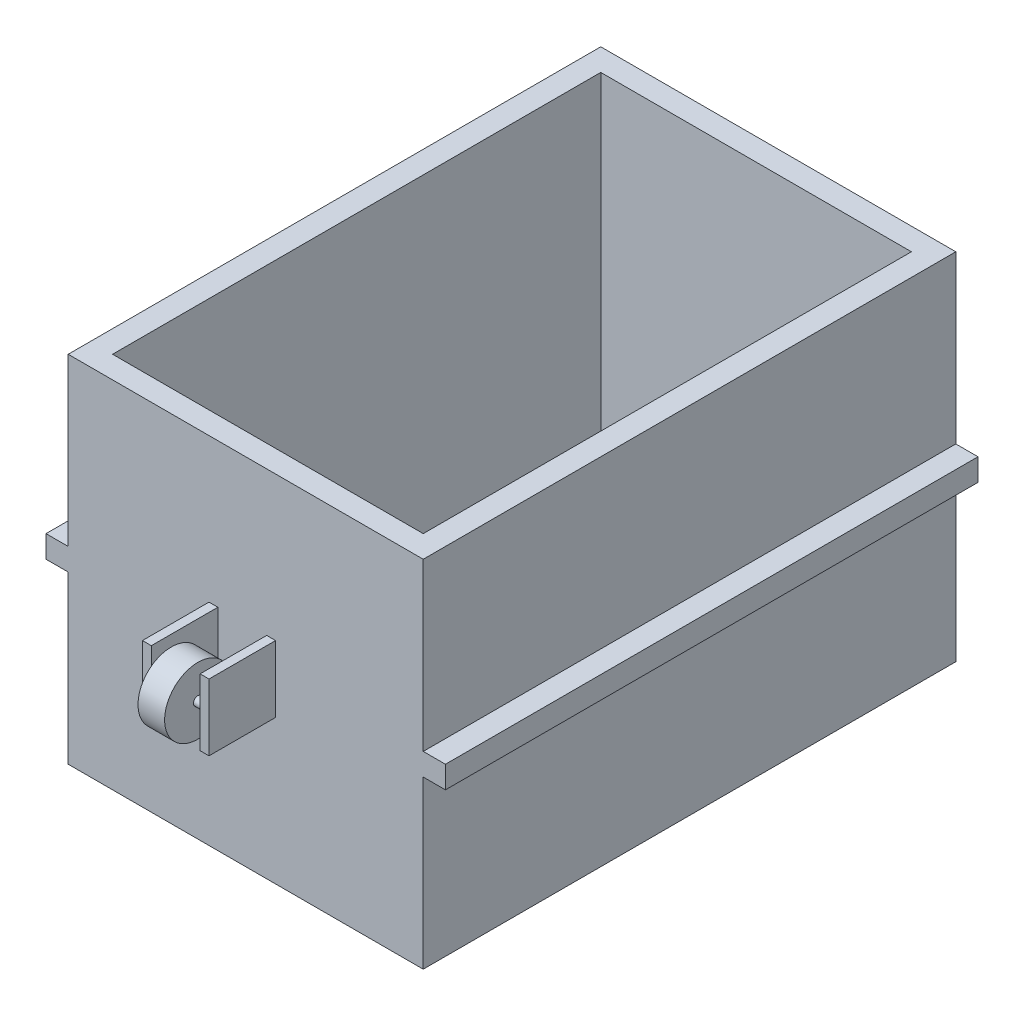
ISO-10303-21;
HEADER;
FILE_DESCRIPTION(('STEP AP214'),'2;1');
FILE_NAME('part.step','',(''),(''),'','','');
FILE_SCHEMA(('AUTOMOTIVE_DESIGN { 1 0 10303 214 1 1 1 1 }'));
ENDSEC;
DATA;
#1=APPLICATION_CONTEXT('core data for automotive mechanical design processes');
#2=APPLICATION_PROTOCOL_DEFINITION('international standard','automotive_design',2000,#1);
#3=PRODUCT_CONTEXT('',#1,'mechanical');
#4=PRODUCT('Part','Part','',(#3));
#5=PRODUCT_RELATED_PRODUCT_CATEGORY('part','',(#4));
#6=PRODUCT_DEFINITION_FORMATION('','',#4);
#7=PRODUCT_DEFINITION_CONTEXT('part definition',#1,'design');
#8=PRODUCT_DEFINITION('design','',#6,#7);
#9=PRODUCT_DEFINITION_SHAPE('','',#8);
#10=(LENGTH_UNIT() NAMED_UNIT(*) SI_UNIT(.MILLI.,.METRE.));
#11=(NAMED_UNIT(*) PLANE_ANGLE_UNIT() SI_UNIT($,.RADIAN.));
#12=(NAMED_UNIT(*) SI_UNIT($,.STERADIAN.) SOLID_ANGLE_UNIT());
#13=UNCERTAINTY_MEASURE_WITH_UNIT(LENGTH_MEASURE(1.E-05),#10,'distance_accuracy_value','');
#14=(GEOMETRIC_REPRESENTATION_CONTEXT(3) GLOBAL_UNCERTAINTY_ASSIGNED_CONTEXT((#13)) GLOBAL_UNIT_ASSIGNED_CONTEXT((#10,
#11,#12)) REPRESENTATION_CONTEXT('',''));
#15=CARTESIAN_POINT('',(0.,0.,0.));
#16=DIRECTION('',(0.,0.,1.));
#17=DIRECTION('',(1.,0.,0.));
#18=AXIS2_PLACEMENT_3D('',#15,#16,#17);
#19=CARTESIAN_POINT('',(167.145511261021,-200.,665.));
#20=DIRECTION('',(1.,0.,0.));
#21=DIRECTION('',(0.,0.,-1.));
#22=AXIS2_PLACEMENT_3D('',#19,#20,#21);
#23=CYLINDRICAL_SURFACE('',#22,5.00000000000005);
#24=CARTESIAN_POINT('',(168.645511261021,-200.,665.));
#25=DIRECTION('',(1.,0.,0.));
#26=DIRECTION('',(0.,0.,-1.));
#27=AXIS2_PLACEMENT_3D('',#24,#25,#26);
#28=CIRCLE('',#27,5.00000000000005);
#29=CARTESIAN_POINT('',(168.645511261021,-200.,660.));
#30=VERTEX_POINT('',#29);
#31=EDGE_CURVE('E41',#30,#30,#28,.T.);
#32=ORIENTED_EDGE('',*,*,#31,.T.);
#33=EDGE_LOOP('',(#32));
#34=FACE_BOUND('',#33,.T.);
#35=CARTESIAN_POINT('',(181.145511261021,-200.,665.));
#36=DIRECTION('',(1.,0.,0.));
#37=DIRECTION('',(0.,0.,-1.));
#38=AXIS2_PLACEMENT_3D('',#35,#36,#37);
#39=CIRCLE('',#38,5.00000000000005);
#40=CARTESIAN_POINT('',(181.145511261021,-200.,660.));
#41=VERTEX_POINT('',#40);
#42=EDGE_CURVE('E36',#41,#41,#39,.F.);
#43=ORIENTED_EDGE('',*,*,#42,.T.);
#44=EDGE_LOOP('',(#43));
#45=FACE_BOUND('',#44,.T.);
#46=ADVANCED_FACE('F32',(#34,#45),#23,.T.);
#47=CARTESIAN_POINT('',(233.645511261021,-162.5,675.));
#48=DIRECTION('',(0.,-1.,0.));
#49=DIRECTION('',(0.,0.,-1.));
#50=AXIS2_PLACEMENT_3D('',#47,#48,#49);
#51=PLANE('',#50);
#52=DIRECTION('',(0.,0.,-1.));
#53=VECTOR('',#52,1.);
#54=CARTESIAN_POINT('',(168.645511261021,-162.5,675.));
#55=LINE('',#54,#53);
#56=CARTESIAN_POINT('',(168.645511261021,-162.5,675.));
#57=VERTEX_POINT('',#56);
#58=CARTESIAN_POINT('',(168.645511261021,-162.5,600.));
#59=VERTEX_POINT('',#58);
#60=EDGE_CURVE('E48',#57,#59,#55,.T.);
#61=ORIENTED_EDGE('',*,*,#60,.T.);
#62=DIRECTION('',(-1.,0.,0.));
#63=VECTOR('',#62,1.);
#64=CARTESIAN_POINT('',(233.645511261021,-162.5,600.));
#65=LINE('',#64,#63);
#66=CARTESIAN_POINT('',(158.645511261021,-162.5,600.));
#67=VERTEX_POINT('',#66);
#68=EDGE_CURVE('E210',#59,#67,#65,.T.);
#69=ORIENTED_EDGE('',*,*,#68,.T.);
#70=DIRECTION('',(0.,0.,-1.));
#71=VECTOR('',#70,1.);
#72=CARTESIAN_POINT('',(158.645511261021,-162.5,675.));
#73=LINE('',#72,#71);
#74=CARTESIAN_POINT('',(158.645511261021,-162.5,675.));
#75=VERTEX_POINT('',#74);
#76=EDGE_CURVE('E228',#75,#67,#73,.T.);
#77=ORIENTED_EDGE('',*,*,#76,.F.);
#78=DIRECTION('',(-1.,0.,0.));
#79=VECTOR('',#78,1.);
#80=CARTESIAN_POINT('',(233.645511261021,-162.5,675.));
#81=LINE('',#80,#79);
#82=EDGE_CURVE('E217',#57,#75,#81,.T.);
#83=ORIENTED_EDGE('',*,*,#82,.F.);
#84=EDGE_LOOP('',(#61,#69,#77,#83));
#85=FACE_BOUND('',#84,.T.);
#86=ADVANCED_FACE('F372',(#85),#51,.F.);
#87=CARTESIAN_POINT('',(233.645511261021,-237.5,675.));
#88=DIRECTION('',(0.,1.,0.));
#89=DIRECTION('',(-1.,0.,0.));
#90=AXIS2_PLACEMENT_3D('',#87,#88,#89);
#91=PLANE('',#90);
#92=DIRECTION('',(0.,0.,-1.));
#93=VECTOR('',#92,1.);
#94=CARTESIAN_POINT('',(168.645511261021,-237.5,675.));
#95=LINE('',#94,#93);
#96=CARTESIAN_POINT('',(168.645511261021,-237.5,675.));
#97=VERTEX_POINT('',#96);
#98=CARTESIAN_POINT('',(168.645511261021,-237.5,600.));
#99=VERTEX_POINT('',#98);
#100=EDGE_CURVE('E194',#97,#99,#95,.T.);
#101=ORIENTED_EDGE('',*,*,#100,.F.);
#102=DIRECTION('',(1.,0.,0.));
#103=VECTOR('',#102,1.);
#104=CARTESIAN_POINT('',(233.645511261021,-237.5,675.));
#105=LINE('',#104,#103);
#106=CARTESIAN_POINT('',(158.645511261021,-237.5,675.));
#107=VERTEX_POINT('',#106);
#108=EDGE_CURVE('E226',#107,#97,#105,.T.);
#109=ORIENTED_EDGE('',*,*,#108,.F.);
#110=DIRECTION('',(0.,0.,-1.));
#111=VECTOR('',#110,1.);
#112=CARTESIAN_POINT('',(158.645511261021,-237.5,675.));
#113=LINE('',#112,#111);
#114=CARTESIAN_POINT('',(158.645511261021,-237.5,600.));
#115=VERTEX_POINT('',#114);
#116=EDGE_CURVE('E56',#107,#115,#113,.T.);
#117=ORIENTED_EDGE('',*,*,#116,.T.);
#118=DIRECTION('',(1.,0.,0.));
#119=VECTOR('',#118,1.);
#120=CARTESIAN_POINT('',(233.645511261021,-237.5,600.));
#121=LINE('',#120,#119);
#122=EDGE_CURVE('E209',#115,#99,#121,.T.);
#123=ORIENTED_EDGE('',*,*,#122,.T.);
#124=EDGE_LOOP('',(#101,#109,#117,#123));
#125=FACE_BOUND('',#124,.T.);
#126=ADVANCED_FACE('F212',(#125),#91,.F.);
#127=CARTESIAN_POINT('',(0.,0.,675.));
#128=DIRECTION('',(0.,0.,1.));
#129=DIRECTION('',(1.,0.,0.));
#130=AXIS2_PLACEMENT_3D('',#127,#128,#129);
#131=PLANE('',#130);
#132=ORIENTED_EDGE('',*,*,#108,.T.);
#133=DIRECTION('',(0.,1.,0.));
#134=VECTOR('',#133,1.);
#135=CARTESIAN_POINT('',(168.645511261021,-237.5,675.));
#136=LINE('',#135,#134);
#137=EDGE_CURVE('E198',#97,#57,#136,.T.);
#138=ORIENTED_EDGE('',*,*,#137,.T.);
#139=ORIENTED_EDGE('',*,*,#82,.T.);
#140=DIRECTION('',(0.,-1.,0.));
#141=VECTOR('',#140,1.);
#142=CARTESIAN_POINT('',(158.645511261021,-237.5,675.));
#143=LINE('',#142,#141);
#144=EDGE_CURVE('E420',#75,#107,#143,.T.);
#145=ORIENTED_EDGE('',*,*,#144,.T.);
#146=EDGE_LOOP('',(#132,#138,#139,#145));
#147=FACE_BOUND('',#146,.T.);
#148=ADVANCED_FACE('F436',(#147),#131,.T.);
#149=CARTESIAN_POINT('',(0.,0.,600.));
#150=DIRECTION('',(0.,0.,1.));
#151=DIRECTION('',(1.,0.,0.));
#152=AXIS2_PLACEMENT_3D('',#149,#150,#151);
#153=PLANE('',#152);
#154=ORIENTED_EDGE('',*,*,#68,.F.);
#155=DIRECTION('',(0.,1.,0.));
#156=VECTOR('',#155,1.);
#157=CARTESIAN_POINT('',(168.645511261021,-237.5,600.));
#158=LINE('',#157,#156);
#159=EDGE_CURVE('E197',#99,#59,#158,.T.);
#160=ORIENTED_EDGE('',*,*,#159,.F.);
#161=ORIENTED_EDGE('',*,*,#122,.F.);
#162=DIRECTION('',(0.,-1.,0.));
#163=VECTOR('',#162,1.);
#164=CARTESIAN_POINT('',(158.645511261021,-237.5,600.));
#165=LINE('',#164,#163);
#166=EDGE_CURVE('E219',#67,#115,#165,.T.);
#167=ORIENTED_EDGE('',*,*,#166,.F.);
#168=EDGE_LOOP('',(#154,#160,#161,#167));
#169=FACE_BOUND('',#168,.T.);
#170=DIRECTION('',(0.,-1.,0.));
#171=VECTOR('',#170,1.);
#172=CARTESIAN_POINT('',(0.,0.,600.));
#173=LINE('',#172,#171);
#174=CARTESIAN_POINT('',(0.,0.,600.));
#175=VERTEX_POINT('',#174);
#176=CARTESIAN_POINT('',(0.,-187.5,600.));
#177=VERTEX_POINT('',#176);
#178=EDGE_CURVE('E316',#175,#177,#173,.T.);
#179=ORIENTED_EDGE('',*,*,#178,.T.);
#180=DIRECTION('',(-1.,0.,0.));
#181=VECTOR('',#180,1.);
#182=CARTESIAN_POINT('',(0.,-187.5,600.));
#183=LINE('',#182,#181);
#184=CARTESIAN_POINT('',(-25.,-187.5,600.));
#185=VERTEX_POINT('',#184);
#186=EDGE_CURVE('E233',#177,#185,#183,.T.);
#187=ORIENTED_EDGE('',*,*,#186,.T.);
#188=DIRECTION('',(0.,-1.,0.));
#189=VECTOR('',#188,1.);
#190=CARTESIAN_POINT('',(-25.,-212.5,600.));
#191=LINE('',#190,#189);
#192=CARTESIAN_POINT('',(-25.,-212.5,600.));
#193=VERTEX_POINT('',#192);
#194=EDGE_CURVE('E246',#185,#193,#191,.T.);
#195=ORIENTED_EDGE('',*,*,#194,.T.);
#196=DIRECTION('',(1.,0.,0.));
#197=VECTOR('',#196,1.);
#198=CARTESIAN_POINT('',(0.,-212.5,600.));
#199=LINE('',#198,#197);
#200=CARTESIAN_POINT('',(0.,-212.5,600.));
#201=VERTEX_POINT('',#200);
#202=EDGE_CURVE('E238',#193,#201,#199,.T.);
#203=ORIENTED_EDGE('',*,*,#202,.T.);
#204=CARTESIAN_POINT('',(0.,-400.,600.));
#205=VERTEX_POINT('',#204);
#206=EDGE_CURVE('E320',#201,#205,#173,.T.);
#207=ORIENTED_EDGE('',*,*,#206,.T.);
#208=DIRECTION('',(1.,0.,0.));
#209=VECTOR('',#208,1.);
#210=CARTESIAN_POINT('',(0.,-400.,600.));
#211=LINE('',#210,#209);
#212=CARTESIAN_POINT('',(400.,-400.,600.));
#213=VERTEX_POINT('',#212);
#214=EDGE_CURVE('E319',#205,#213,#211,.T.);
#215=ORIENTED_EDGE('',*,*,#214,.T.);
#216=DIRECTION('',(0.,1.,0.));
#217=VECTOR('',#216,1.);
#218=CARTESIAN_POINT('',(400.,0.,600.));
#219=LINE('',#218,#217);
#220=CARTESIAN_POINT('',(400.,-212.5,600.));
#221=VERTEX_POINT('',#220);
#222=EDGE_CURVE('E323',#213,#221,#219,.T.);
#223=ORIENTED_EDGE('',*,*,#222,.T.);
#224=DIRECTION('',(1.,0.,0.));
#225=VECTOR('',#224,1.);
#226=CARTESIAN_POINT('',(400.,-212.5,600.));
#227=LINE('',#226,#225);
#228=CARTESIAN_POINT('',(425.,-212.5,600.));
#229=VERTEX_POINT('',#228);
#230=EDGE_CURVE('E253',#221,#229,#227,.T.);
#231=ORIENTED_EDGE('',*,*,#230,.T.);
#232=DIRECTION('',(0.,1.,0.));
#233=VECTOR('',#232,1.);
#234=CARTESIAN_POINT('',(425.,-212.5,600.));
#235=LINE('',#234,#233);
#236=CARTESIAN_POINT('',(425.,-187.5,600.));
#237=VERTEX_POINT('',#236);
#238=EDGE_CURVE('E272',#229,#237,#235,.T.);
#239=ORIENTED_EDGE('',*,*,#238,.T.);
#240=DIRECTION('',(-1.,0.,0.));
#241=VECTOR('',#240,1.);
#242=CARTESIAN_POINT('',(400.,-187.5,600.));
#243=LINE('',#242,#241);
#244=CARTESIAN_POINT('',(400.,-187.5,600.));
#245=VERTEX_POINT('',#244);
#246=EDGE_CURVE('E264',#237,#245,#243,.T.);
#247=ORIENTED_EDGE('',*,*,#246,.T.);
#248=CARTESIAN_POINT('',(400.,0.,600.));
#249=VERTEX_POINT('',#248);
#250=EDGE_CURVE('E322',#245,#249,#219,.T.);
#251=ORIENTED_EDGE('',*,*,#250,.T.);
#252=DIRECTION('',(-1.,0.,0.));
#253=VECTOR('',#252,1.);
#254=CARTESIAN_POINT('',(0.,0.,600.));
#255=LINE('',#254,#253);
#256=EDGE_CURVE('E326',#249,#175,#255,.T.);
#257=ORIENTED_EDGE('',*,*,#256,.T.);
#258=EDGE_LOOP('',(#179,#187,#195,#203,#207,#215,#223,#231,#239,#247,#251,#257));
#259=FACE_BOUND('',#258,.T.);
#260=CARTESIAN_POINT('',(233.645511261021,-162.5,600.));
#261=VERTEX_POINT('',#260);
#262=CARTESIAN_POINT('',(223.645511261021,-162.5,600.));
#263=VERTEX_POINT('',#262);
#264=EDGE_CURVE('E425',#261,#263,#65,.T.);
#265=ORIENTED_EDGE('',*,*,#264,.F.);
#266=DIRECTION('',(0.,1.,0.));
#267=VECTOR('',#266,1.);
#268=CARTESIAN_POINT('',(233.645511261021,-237.5,600.));
#269=LINE('',#268,#267);
#270=CARTESIAN_POINT('',(233.645511261021,-237.5,600.));
#271=VERTEX_POINT('',#270);
#272=EDGE_CURVE('E413',#271,#261,#269,.T.);
#273=ORIENTED_EDGE('',*,*,#272,.F.);
#274=CARTESIAN_POINT('',(223.645511261021,-237.5,600.));
#275=VERTEX_POINT('',#274);
#276=EDGE_CURVE('E214',#275,#271,#121,.T.);
#277=ORIENTED_EDGE('',*,*,#276,.F.);
#278=DIRECTION('',(0.,1.,0.));
#279=VECTOR('',#278,1.);
#280=CARTESIAN_POINT('',(223.645511261021,-237.5,600.));
#281=LINE('',#280,#279);
#282=EDGE_CURVE('E411',#275,#263,#281,.T.);
#283=ORIENTED_EDGE('',*,*,#282,.T.);
#284=EDGE_LOOP('',(#265,#273,#277,#283));
#285=FACE_BOUND('',#284,.T.);
#286=ADVANCED_FACE('F206',(#169,#259,#285),#153,.T.);
#287=CARTESIAN_POINT('',(0.,0.,600.));
#288=DIRECTION('',(1.,0.,0.));
#289=DIRECTION('',(0.,1.,0.));
#290=AXIS2_PLACEMENT_3D('',#287,#288,#289);
#291=PLANE('',#290);
#292=DIRECTION('',(0.,0.,1.));
#293=VECTOR('',#292,1.);
#294=CARTESIAN_POINT('',(0.,-212.5,0.));
#295=LINE('',#294,#293);
#296=CARTESIAN_POINT('',(0.,-212.5,0.));
#297=VERTEX_POINT('',#296);
#298=EDGE_CURVE('E251',#297,#201,#295,.T.);
#299=ORIENTED_EDGE('',*,*,#298,.F.);
#300=DIRECTION('',(0.,-1.,0.));
#301=VECTOR('',#300,1.);
#302=CARTESIAN_POINT('',(0.,0.,0.));
#303=LINE('',#302,#301);
#304=CARTESIAN_POINT('',(0.,-400.,0.));
#305=VERTEX_POINT('',#304);
#306=EDGE_CURVE('E309',#297,#305,#303,.T.);
#307=ORIENTED_EDGE('',*,*,#306,.T.);
#308=DIRECTION('',(0.,0.,-1.));
#309=VECTOR('',#308,1.);
#310=CARTESIAN_POINT('',(0.,-400.,600.));
#311=LINE('',#310,#309);
#312=EDGE_CURVE('E348',#205,#305,#311,.T.);
#313=ORIENTED_EDGE('',*,*,#312,.F.);
#314=ORIENTED_EDGE('',*,*,#206,.F.);
#315=EDGE_LOOP('',(#299,#307,#313,#314));
#316=FACE_BOUND('',#315,.T.);
#317=ADVANCED_FACE('F442',(#316),#291,.F.);
#318=CARTESIAN_POINT('',(400.,0.,600.));
#319=DIRECTION('',(-1.,0.,0.));
#320=DIRECTION('',(0.,-1.,0.));
#321=AXIS2_PLACEMENT_3D('',#318,#319,#320);
#322=PLANE('',#321);
#323=DIRECTION('',(0.,0.,1.));
#324=VECTOR('',#323,1.);
#325=CARTESIAN_POINT('',(400.,-187.5,0.));
#326=LINE('',#325,#324);
#327=CARTESIAN_POINT('',(400.,-187.5,0.));
#328=VERTEX_POINT('',#327);
#329=EDGE_CURVE('E277',#328,#245,#326,.T.);
#330=ORIENTED_EDGE('',*,*,#329,.F.);
#331=DIRECTION('',(0.,1.,0.));
#332=VECTOR('',#331,1.);
#333=CARTESIAN_POINT('',(400.,0.,0.));
#334=LINE('',#333,#332);
#335=CARTESIAN_POINT('',(400.,0.,0.));
#336=VERTEX_POINT('',#335);
#337=EDGE_CURVE('E334',#328,#336,#334,.T.);
#338=ORIENTED_EDGE('',*,*,#337,.T.);
#339=DIRECTION('',(0.,0.,-1.));
#340=VECTOR('',#339,1.);
#341=CARTESIAN_POINT('',(400.,0.,600.));
#342=LINE('',#341,#340);
#343=EDGE_CURVE('E342',#249,#336,#342,.T.);
#344=ORIENTED_EDGE('',*,*,#343,.F.);
#345=ORIENTED_EDGE('',*,*,#250,.F.);
#346=EDGE_LOOP('',(#330,#338,#344,#345));
#347=FACE_BOUND('',#346,.T.);
#348=ADVANCED_FACE('F527',(#347),#322,.F.);
#349=CARTESIAN_POINT('',(0.,0.,0.));
#350=VERTEX_POINT('',#349);
#351=CARTESIAN_POINT('',(0.,-187.5,0.));
#352=VERTEX_POINT('',#351);
#353=EDGE_CURVE('E329',#350,#352,#303,.T.);
#354=ORIENTED_EDGE('',*,*,#353,.T.);
#355=DIRECTION('',(0.,0.,1.));
#356=VECTOR('',#355,1.);
#357=CARTESIAN_POINT('',(0.,-187.5,0.));
#358=LINE('',#357,#356);
#359=EDGE_CURVE('E243',#352,#177,#358,.T.);
#360=ORIENTED_EDGE('',*,*,#359,.T.);
#361=ORIENTED_EDGE('',*,*,#178,.F.);
#362=DIRECTION('',(0.,0.,-1.));
#363=VECTOR('',#362,1.);
#364=CARTESIAN_POINT('',(0.,0.,600.));
#365=LINE('',#364,#363);
#366=EDGE_CURVE('E328',#175,#350,#365,.T.);
#367=ORIENTED_EDGE('',*,*,#366,.T.);
#368=EDGE_LOOP('',(#354,#360,#361,#367));
#369=FACE_BOUND('',#368,.T.);
#370=ADVANCED_FACE('F34',(#369),#291,.F.);
#371=CARTESIAN_POINT('',(0.,-400.,600.));
#372=DIRECTION('',(0.,1.,0.));
#373=DIRECTION('',(0.,0.,1.));
#374=AXIS2_PLACEMENT_3D('',#371,#372,#373);
#375=PLANE('',#374);
#376=DIRECTION('',(1.,0.,0.));
#377=VECTOR('',#376,1.);
#378=CARTESIAN_POINT('',(0.,-400.,0.));
#379=LINE('',#378,#377);
#380=CARTESIAN_POINT('',(400.,-400.,0.));
#381=VERTEX_POINT('',#380);
#382=EDGE_CURVE('E332',#305,#381,#379,.T.);
#383=ORIENTED_EDGE('',*,*,#382,.T.);
#384=DIRECTION('',(0.,0.,-1.));
#385=VECTOR('',#384,1.);
#386=CARTESIAN_POINT('',(400.,-400.,600.));
#387=LINE('',#386,#385);
#388=EDGE_CURVE('E345',#213,#381,#387,.T.);
#389=ORIENTED_EDGE('',*,*,#388,.F.);
#390=ORIENTED_EDGE('',*,*,#214,.F.);
#391=ORIENTED_EDGE('',*,*,#312,.T.);
#392=EDGE_LOOP('',(#383,#389,#390,#391));
#393=FACE_BOUND('',#392,.T.);
#394=ADVANCED_FACE('F525',(#393),#375,.F.);
#395=CARTESIAN_POINT('',(400.,-212.5,0.));
#396=VERTEX_POINT('',#395);
#397=EDGE_CURVE('E335',#381,#396,#334,.T.);
#398=ORIENTED_EDGE('',*,*,#397,.T.);
#399=DIRECTION('',(0.,0.,1.));
#400=VECTOR('',#399,1.);
#401=CARTESIAN_POINT('',(400.,-212.5,0.));
#402=LINE('',#401,#400);
#403=EDGE_CURVE('E269',#396,#221,#402,.T.);
#404=ORIENTED_EDGE('',*,*,#403,.T.);
#405=ORIENTED_EDGE('',*,*,#222,.F.);
#406=ORIENTED_EDGE('',*,*,#388,.T.);
#407=EDGE_LOOP('',(#398,#404,#405,#406));
#408=FACE_BOUND('',#407,.T.);
#409=ADVANCED_FACE('F522',(#408),#322,.F.);
#410=CARTESIAN_POINT('',(0.,0.,600.));
#411=DIRECTION('',(0.,-1.,0.));
#412=DIRECTION('',(0.,0.,-1.));
#413=AXIS2_PLACEMENT_3D('',#410,#411,#412);
#414=PLANE('',#413);
#415=DIRECTION('',(0.,0.,-1.));
#416=VECTOR('',#415,1.);
#417=CARTESIAN_POINT('',(25.,0.,575.));
#418=LINE('',#417,#416);
#419=CARTESIAN_POINT('',(25.,0.,575.));
#420=VERTEX_POINT('',#419);
#421=CARTESIAN_POINT('',(25.,0.,25.));
#422=VERTEX_POINT('',#421);
#423=EDGE_CURVE('E299',#420,#422,#418,.T.);
#424=ORIENTED_EDGE('',*,*,#423,.T.);
#425=DIRECTION('',(-1.,0.,0.));
#426=VECTOR('',#425,1.);
#427=CARTESIAN_POINT('',(375.,0.,25.));
#428=LINE('',#427,#426);
#429=CARTESIAN_POINT('',(375.,0.,25.));
#430=VERTEX_POINT('',#429);
#431=EDGE_CURVE('E279',#430,#422,#428,.T.);
#432=ORIENTED_EDGE('',*,*,#431,.F.);
#433=DIRECTION('',(0.,0.,-1.));
#434=VECTOR('',#433,1.);
#435=CARTESIAN_POINT('',(375.,0.,575.));
#436=LINE('',#435,#434);
#437=CARTESIAN_POINT('',(375.,0.,575.));
#438=VERTEX_POINT('',#437);
#439=EDGE_CURVE('E290',#438,#430,#436,.T.);
#440=ORIENTED_EDGE('',*,*,#439,.F.);
#441=DIRECTION('',(-1.,0.,0.));
#442=VECTOR('',#441,1.);
#443=CARTESIAN_POINT('',(375.,0.,575.));
#444=LINE('',#443,#442);
#445=EDGE_CURVE('E302',#438,#420,#444,.T.);
#446=ORIENTED_EDGE('',*,*,#445,.T.);
#447=EDGE_LOOP('',(#424,#432,#440,#446));
#448=FACE_BOUND('',#447,.T.);
#449=DIRECTION('',(-1.,0.,0.));
#450=VECTOR('',#449,1.);
#451=CARTESIAN_POINT('',(0.,0.,0.));
#452=LINE('',#451,#450);
#453=EDGE_CURVE('E338',#336,#350,#452,.T.);
#454=ORIENTED_EDGE('',*,*,#453,.T.);
#455=ORIENTED_EDGE('',*,*,#366,.F.);
#456=ORIENTED_EDGE('',*,*,#256,.F.);
#457=ORIENTED_EDGE('',*,*,#343,.T.);
#458=EDGE_LOOP('',(#454,#455,#456,#457));
#459=FACE_BOUND('',#458,.T.);
#460=ADVANCED_FACE('F518',(#448,#459),#414,.F.);
#461=CARTESIAN_POINT('',(0.,0.,0.));
#462=DIRECTION('',(0.,0.,1.));
#463=DIRECTION('',(1.,0.,0.));
#464=AXIS2_PLACEMENT_3D('',#461,#462,#463);
#465=PLANE('',#464);
#466=ORIENTED_EDGE('',*,*,#353,.F.);
#467=ORIENTED_EDGE('',*,*,#453,.F.);
#468=ORIENTED_EDGE('',*,*,#337,.F.);
#469=DIRECTION('',(-1.,0.,0.));
#470=VECTOR('',#469,1.);
#471=CARTESIAN_POINT('',(400.,-187.5,0.));
#472=LINE('',#471,#470);
#473=CARTESIAN_POINT('',(425.,-187.5,0.));
#474=VERTEX_POINT('',#473);
#475=EDGE_CURVE('E267',#474,#328,#472,.T.);
#476=ORIENTED_EDGE('',*,*,#475,.F.);
#477=DIRECTION('',(0.,1.,0.));
#478=VECTOR('',#477,1.);
#479=CARTESIAN_POINT('',(425.,-212.5,0.));
#480=LINE('',#479,#478);
#481=CARTESIAN_POINT('',(425.,-212.5,0.));
#482=VERTEX_POINT('',#481);
#483=EDGE_CURVE('E263',#482,#474,#480,.T.);
#484=ORIENTED_EDGE('',*,*,#483,.F.);
#485=DIRECTION('',(1.,0.,0.));
#486=VECTOR('',#485,1.);
#487=CARTESIAN_POINT('',(400.,-212.5,0.));
#488=LINE('',#487,#486);
#489=EDGE_CURVE('E260',#396,#482,#488,.T.);
#490=ORIENTED_EDGE('',*,*,#489,.F.);
#491=ORIENTED_EDGE('',*,*,#397,.F.);
#492=ORIENTED_EDGE('',*,*,#382,.F.);
#493=ORIENTED_EDGE('',*,*,#306,.F.);
#494=DIRECTION('',(1.,0.,0.));
#495=VECTOR('',#494,1.);
#496=CARTESIAN_POINT('',(0.,-212.5,0.));
#497=LINE('',#496,#495);
#498=CARTESIAN_POINT('',(-25.,-212.5,0.));
#499=VERTEX_POINT('',#498);
#500=EDGE_CURVE('E241',#499,#297,#497,.T.);
#501=ORIENTED_EDGE('',*,*,#500,.F.);
#502=DIRECTION('',(0.,-1.,0.));
#503=VECTOR('',#502,1.);
#504=CARTESIAN_POINT('',(-25.,-212.5,0.));
#505=LINE('',#504,#503);
#506=CARTESIAN_POINT('',(-25.,-187.5,0.));
#507=VERTEX_POINT('',#506);
#508=EDGE_CURVE('E237',#507,#499,#505,.T.);
#509=ORIENTED_EDGE('',*,*,#508,.F.);
#510=DIRECTION('',(-1.,0.,0.));
#511=VECTOR('',#510,1.);
#512=CARTESIAN_POINT('',(0.,-187.5,0.));
#513=LINE('',#512,#511);
#514=EDGE_CURVE('E234',#352,#507,#513,.T.);
#515=ORIENTED_EDGE('',*,*,#514,.F.);
#516=EDGE_LOOP('',(#466,#467,#468,#476,#484,#490,#491,#492,#493,#501,#509,#515));
#517=FACE_BOUND('',#516,.T.);
#518=ADVANCED_FACE('F513',(#517),#465,.F.);
#519=CARTESIAN_POINT('',(375.,-375.,25.));
#520=DIRECTION('',(0.,0.,-1.));
#521=DIRECTION('',(-1.,0.,0.));
#522=AXIS2_PLACEMENT_3D('',#519,#520,#521);
#523=PLANE('',#522);
#524=ORIENTED_EDGE('',*,*,#431,.T.);
#525=DIRECTION('',(0.,1.,0.));
#526=VECTOR('',#525,1.);
#527=CARTESIAN_POINT('',(25.,-375.,25.));
#528=LINE('',#527,#526);
#529=CARTESIAN_POINT('',(25.,-375.,25.));
#530=VERTEX_POINT('',#529);
#531=EDGE_CURVE('E297',#530,#422,#528,.T.);
#532=ORIENTED_EDGE('',*,*,#531,.F.);
#533=DIRECTION('',(-1.,0.,0.));
#534=VECTOR('',#533,1.);
#535=CARTESIAN_POINT('',(375.,-375.,25.));
#536=LINE('',#535,#534);
#537=CARTESIAN_POINT('',(375.,-375.,25.));
#538=VERTEX_POINT('',#537);
#539=EDGE_CURVE('E286',#538,#530,#536,.T.);
#540=ORIENTED_EDGE('',*,*,#539,.F.);
#541=DIRECTION('',(0.,1.,0.));
#542=VECTOR('',#541,1.);
#543=CARTESIAN_POINT('',(375.,-375.,25.));
#544=LINE('',#543,#542);
#545=EDGE_CURVE('E307',#538,#430,#544,.T.);
#546=ORIENTED_EDGE('',*,*,#545,.T.);
#547=EDGE_LOOP('',(#524,#532,#540,#546));
#548=FACE_BOUND('',#547,.T.);
#549=ADVANCED_FACE('F504',(#548),#523,.F.);
#550=CARTESIAN_POINT('',(375.,-375.,575.));
#551=DIRECTION('',(1.,0.,0.));
#552=DIRECTION('',(0.,0.,-1.));
#553=AXIS2_PLACEMENT_3D('',#550,#551,#552);
#554=PLANE('',#553);
#555=ORIENTED_EDGE('',*,*,#439,.T.);
#556=ORIENTED_EDGE('',*,*,#545,.F.);
#557=DIRECTION('',(0.,0.,-1.));
#558=VECTOR('',#557,1.);
#559=CARTESIAN_POINT('',(375.,-375.,575.));
#560=LINE('',#559,#558);
#561=CARTESIAN_POINT('',(375.,-375.,575.));
#562=VERTEX_POINT('',#561);
#563=EDGE_CURVE('E294',#562,#538,#560,.T.);
#564=ORIENTED_EDGE('',*,*,#563,.F.);
#565=DIRECTION('',(0.,1.,0.));
#566=VECTOR('',#565,1.);
#567=CARTESIAN_POINT('',(375.,-375.,575.));
#568=LINE('',#567,#566);
#569=EDGE_CURVE('E310',#562,#438,#568,.T.);
#570=ORIENTED_EDGE('',*,*,#569,.T.);
#571=EDGE_LOOP('',(#555,#556,#564,#570));
#572=FACE_BOUND('',#571,.T.);
#573=ADVANCED_FACE('F500',(#572),#554,.F.);
#574=CARTESIAN_POINT('',(375.,-375.,575.));
#575=DIRECTION('',(0.,0.,-1.));
#576=DIRECTION('',(-1.,0.,0.));
#577=AXIS2_PLACEMENT_3D('',#574,#575,#576);
#578=PLANE('',#577);
#579=ORIENTED_EDGE('',*,*,#445,.F.);
#580=ORIENTED_EDGE('',*,*,#569,.F.);
#581=DIRECTION('',(-1.,0.,0.));
#582=VECTOR('',#581,1.);
#583=CARTESIAN_POINT('',(375.,-375.,575.));
#584=LINE('',#583,#582);
#585=CARTESIAN_POINT('',(25.,-375.,575.));
#586=VERTEX_POINT('',#585);
#587=EDGE_CURVE('E292',#562,#586,#584,.T.);
#588=ORIENTED_EDGE('',*,*,#587,.T.);
#589=DIRECTION('',(0.,1.,0.));
#590=VECTOR('',#589,1.);
#591=CARTESIAN_POINT('',(25.,-375.,575.));
#592=LINE('',#591,#590);
#593=EDGE_CURVE('E312',#586,#420,#592,.T.);
#594=ORIENTED_EDGE('',*,*,#593,.T.);
#595=EDGE_LOOP('',(#579,#580,#588,#594));
#596=FACE_BOUND('',#595,.T.);
#597=ADVANCED_FACE('F503',(#596),#578,.T.);
#598=CARTESIAN_POINT('',(25.,-375.,575.));
#599=DIRECTION('',(1.,0.,0.));
#600=DIRECTION('',(0.,0.,-1.));
#601=AXIS2_PLACEMENT_3D('',#598,#599,#600);
#602=PLANE('',#601);
#603=ORIENTED_EDGE('',*,*,#423,.F.);
#604=ORIENTED_EDGE('',*,*,#593,.F.);
#605=DIRECTION('',(0.,0.,-1.));
#606=VECTOR('',#605,1.);
#607=CARTESIAN_POINT('',(25.,-375.,575.));
#608=LINE('',#607,#606);
#609=EDGE_CURVE('E289',#586,#530,#608,.T.);
#610=ORIENTED_EDGE('',*,*,#609,.T.);
#611=ORIENTED_EDGE('',*,*,#531,.T.);
#612=EDGE_LOOP('',(#603,#604,#610,#611));
#613=FACE_BOUND('',#612,.T.);
#614=ADVANCED_FACE('F498',(#613),#602,.T.);
#615=CARTESIAN_POINT('',(0.,-375.,0.));
#616=DIRECTION('',(0.,-1.,0.));
#617=DIRECTION('',(0.,0.,-1.));
#618=AXIS2_PLACEMENT_3D('',#615,#616,#617);
#619=PLANE('',#618);
#620=ORIENTED_EDGE('',*,*,#539,.T.);
#621=ORIENTED_EDGE('',*,*,#609,.F.);
#622=ORIENTED_EDGE('',*,*,#587,.F.);
#623=ORIENTED_EDGE('',*,*,#563,.T.);
#624=EDGE_LOOP('',(#620,#621,#622,#623));
#625=FACE_BOUND('',#624,.T.);
#626=ADVANCED_FACE('F488',(#625),#619,.F.);
#627=CARTESIAN_POINT('',(400.,-187.5,0.));
#628=DIRECTION('',(0.,1.,0.));
#629=DIRECTION('',(0.,0.,1.));
#630=AXIS2_PLACEMENT_3D('',#627,#628,#629);
#631=PLANE('',#630);
#632=ORIENTED_EDGE('',*,*,#246,.F.);
#633=DIRECTION('',(0.,0.,1.));
#634=VECTOR('',#633,1.);
#635=CARTESIAN_POINT('',(425.,-187.5,0.));
#636=LINE('',#635,#634);
#637=EDGE_CURVE('E280',#474,#237,#636,.T.);
#638=ORIENTED_EDGE('',*,*,#637,.F.);
#639=ORIENTED_EDGE('',*,*,#475,.T.);
#640=ORIENTED_EDGE('',*,*,#329,.T.);
#641=EDGE_LOOP('',(#632,#638,#639,#640));
#642=FACE_BOUND('',#641,.T.);
#643=ADVANCED_FACE('F484',(#642),#631,.T.);
#644=CARTESIAN_POINT('',(425.,-212.5,0.));
#645=DIRECTION('',(1.,0.,0.));
#646=DIRECTION('',(0.,0.,-1.));
#647=AXIS2_PLACEMENT_3D('',#644,#645,#646);
#648=PLANE('',#647);
#649=ORIENTED_EDGE('',*,*,#238,.F.);
#650=DIRECTION('',(0.,0.,1.));
#651=VECTOR('',#650,1.);
#652=CARTESIAN_POINT('',(425.,-212.5,0.));
#653=LINE('',#652,#651);
#654=EDGE_CURVE('E282',#482,#229,#653,.T.);
#655=ORIENTED_EDGE('',*,*,#654,.F.);
#656=ORIENTED_EDGE('',*,*,#483,.T.);
#657=ORIENTED_EDGE('',*,*,#637,.T.);
#658=EDGE_LOOP('',(#649,#655,#656,#657));
#659=FACE_BOUND('',#658,.T.);
#660=ADVANCED_FACE('F487',(#659),#648,.T.);
#661=CARTESIAN_POINT('',(400.,-212.5,0.));
#662=DIRECTION('',(0.,-1.,0.));
#663=DIRECTION('',(1.,0.,0.));
#664=AXIS2_PLACEMENT_3D('',#661,#662,#663);
#665=PLANE('',#664);
#666=ORIENTED_EDGE('',*,*,#230,.F.);
#667=ORIENTED_EDGE('',*,*,#403,.F.);
#668=ORIENTED_EDGE('',*,*,#489,.T.);
#669=ORIENTED_EDGE('',*,*,#654,.T.);
#670=EDGE_LOOP('',(#666,#667,#668,#669));
#671=FACE_BOUND('',#670,.T.);
#672=ADVANCED_FACE('F476',(#671),#665,.T.);
#673=CARTESIAN_POINT('',(0.,-212.5,0.));
#674=DIRECTION('',(0.,-1.,0.));
#675=DIRECTION('',(1.,0.,0.));
#676=AXIS2_PLACEMENT_3D('',#673,#674,#675);
#677=PLANE('',#676);
#678=ORIENTED_EDGE('',*,*,#202,.F.);
#679=DIRECTION('',(0.,0.,1.));
#680=VECTOR('',#679,1.);
#681=CARTESIAN_POINT('',(-25.,-212.5,0.));
#682=LINE('',#681,#680);
#683=EDGE_CURVE('E254',#499,#193,#682,.T.);
#684=ORIENTED_EDGE('',*,*,#683,.F.);
#685=ORIENTED_EDGE('',*,*,#500,.T.);
#686=ORIENTED_EDGE('',*,*,#298,.T.);
#687=EDGE_LOOP('',(#678,#684,#685,#686));
#688=FACE_BOUND('',#687,.T.);
#689=ADVANCED_FACE('F472',(#688),#677,.T.);
#690=CARTESIAN_POINT('',(-25.,-212.5,0.));
#691=DIRECTION('',(-1.,0.,0.));
#692=DIRECTION('',(0.,0.,1.));
#693=AXIS2_PLACEMENT_3D('',#690,#691,#692);
#694=PLANE('',#693);
#695=ORIENTED_EDGE('',*,*,#194,.F.);
#696=DIRECTION('',(0.,0.,1.));
#697=VECTOR('',#696,1.);
#698=CARTESIAN_POINT('',(-25.,-187.5,0.));
#699=LINE('',#698,#697);
#700=EDGE_CURVE('E256',#507,#185,#699,.T.);
#701=ORIENTED_EDGE('',*,*,#700,.F.);
#702=ORIENTED_EDGE('',*,*,#508,.T.);
#703=ORIENTED_EDGE('',*,*,#683,.T.);
#704=EDGE_LOOP('',(#695,#701,#702,#703));
#705=FACE_BOUND('',#704,.T.);
#706=ADVANCED_FACE('F475',(#705),#694,.T.);
#707=CARTESIAN_POINT('',(0.,-187.5,0.));
#708=DIRECTION('',(0.,1.,0.));
#709=DIRECTION('',(0.,0.,1.));
#710=AXIS2_PLACEMENT_3D('',#707,#708,#709);
#711=PLANE('',#710);
#712=ORIENTED_EDGE('',*,*,#186,.F.);
#713=ORIENTED_EDGE('',*,*,#359,.F.);
#714=ORIENTED_EDGE('',*,*,#514,.T.);
#715=ORIENTED_EDGE('',*,*,#700,.T.);
#716=EDGE_LOOP('',(#712,#713,#714,#715));
#717=FACE_BOUND('',#716,.T.);
#718=ADVANCED_FACE('F469',(#717),#711,.T.);
#719=CARTESIAN_POINT('',(233.645511261021,-237.5,675.));
#720=DIRECTION('',(-1.,0.,0.));
#721=DIRECTION('',(0.,0.,1.));
#722=AXIS2_PLACEMENT_3D('',#719,#720,#721);
#723=PLANE('',#722);
#724=ORIENTED_EDGE('',*,*,#272,.T.);
#725=DIRECTION('',(0.,0.,-1.));
#726=VECTOR('',#725,1.);
#727=CARTESIAN_POINT('',(233.645511261021,-162.5,675.));
#728=LINE('',#727,#726);
#729=CARTESIAN_POINT('',(233.645511261021,-162.5,675.));
#730=VERTEX_POINT('',#729);
#731=EDGE_CURVE('E231',#730,#261,#728,.T.);
#732=ORIENTED_EDGE('',*,*,#731,.F.);
#733=DIRECTION('',(0.,1.,0.));
#734=VECTOR('',#733,1.);
#735=CARTESIAN_POINT('',(233.645511261021,-237.5,675.));
#736=LINE('',#735,#734);
#737=CARTESIAN_POINT('',(233.645511261021,-237.5,675.));
#738=VERTEX_POINT('',#737);
#739=EDGE_CURVE('E213',#738,#730,#736,.T.);
#740=ORIENTED_EDGE('',*,*,#739,.F.);
#741=DIRECTION('',(0.,0.,-1.));
#742=VECTOR('',#741,1.);
#743=CARTESIAN_POINT('',(233.645511261021,-237.5,675.));
#744=LINE('',#743,#742);
#745=EDGE_CURVE('E223',#738,#271,#744,.T.);
#746=ORIENTED_EDGE('',*,*,#745,.T.);
#747=EDGE_LOOP('',(#724,#732,#740,#746));
#748=FACE_BOUND('',#747,.T.);
#749=ADVANCED_FACE('F461',(#748),#723,.F.);
#750=ORIENTED_EDGE('',*,*,#264,.T.);
#751=DIRECTION('',(0.,0.,-1.));
#752=VECTOR('',#751,1.);
#753=CARTESIAN_POINT('',(223.645511261021,-162.5,675.));
#754=LINE('',#753,#752);
#755=CARTESIAN_POINT('',(223.645511261021,-162.5,675.));
#756=VERTEX_POINT('',#755);
#757=EDGE_CURVE('E201',#756,#263,#754,.T.);
#758=ORIENTED_EDGE('',*,*,#757,.F.);
#759=EDGE_CURVE('E417',#730,#756,#81,.T.);
#760=ORIENTED_EDGE('',*,*,#759,.F.);
#761=ORIENTED_EDGE('',*,*,#731,.T.);
#762=EDGE_LOOP('',(#750,#758,#760,#761));
#763=FACE_BOUND('',#762,.T.);
#764=ADVANCED_FACE('F378',(#763),#51,.F.);
#765=CARTESIAN_POINT('',(158.645511261021,-237.5,675.));
#766=DIRECTION('',(1.,0.,0.));
#767=DIRECTION('',(0.,0.,-1.));
#768=AXIS2_PLACEMENT_3D('',#765,#766,#767);
#769=PLANE('',#768);
#770=ORIENTED_EDGE('',*,*,#166,.T.);
#771=ORIENTED_EDGE('',*,*,#116,.F.);
#772=ORIENTED_EDGE('',*,*,#144,.F.);
#773=ORIENTED_EDGE('',*,*,#76,.T.);
#774=EDGE_LOOP('',(#770,#771,#772,#773));
#775=FACE_BOUND('',#774,.T.);
#776=ADVANCED_FACE('F434',(#775),#769,.F.);
#777=CARTESIAN_POINT('',(223.645511261021,-237.5,675.));
#778=VERTEX_POINT('',#777);
#779=EDGE_CURVE('E422',#778,#738,#105,.T.);
#780=ORIENTED_EDGE('',*,*,#779,.F.);
#781=DIRECTION('',(0.,0.,-1.));
#782=VECTOR('',#781,1.);
#783=CARTESIAN_POINT('',(223.645511261021,-237.5,675.));
#784=LINE('',#783,#782);
#785=EDGE_CURVE('E200',#778,#275,#784,.T.);
#786=ORIENTED_EDGE('',*,*,#785,.T.);
#787=ORIENTED_EDGE('',*,*,#276,.T.);
#788=ORIENTED_EDGE('',*,*,#745,.F.);
#789=EDGE_LOOP('',(#780,#786,#787,#788));
#790=FACE_BOUND('',#789,.T.);
#791=ADVANCED_FACE('F445',(#790),#91,.F.);
#792=DIRECTION('',(0.,1.,0.));
#793=VECTOR('',#792,1.);
#794=CARTESIAN_POINT('',(223.645511261021,-237.5,675.));
#795=LINE('',#794,#793);
#796=EDGE_CURVE('E414',#778,#756,#795,.T.);
#797=ORIENTED_EDGE('',*,*,#796,.F.);
#798=ORIENTED_EDGE('',*,*,#779,.T.);
#799=ORIENTED_EDGE('',*,*,#739,.T.);
#800=ORIENTED_EDGE('',*,*,#759,.T.);
#801=EDGE_LOOP('',(#797,#798,#799,#800));
#802=FACE_BOUND('',#801,.T.);
#803=ADVANCED_FACE('F367',(#802),#131,.T.);
#804=CARTESIAN_POINT('',(223.645511261021,-237.5,675.));
#805=DIRECTION('',(1.,0.,0.));
#806=DIRECTION('',(0.,0.,-1.));
#807=AXIS2_PLACEMENT_3D('',#804,#805,#806);
#808=PLANE('',#807);
#809=CARTESIAN_POINT('',(223.645511261021,-200.,665.));
#810=DIRECTION('',(1.,0.,0.));
#811=DIRECTION('',(0.,0.,-1.));
#812=AXIS2_PLACEMENT_3D('',#809,#810,#811);
#813=CIRCLE('',#812,5.00000000000005);
#814=CARTESIAN_POINT('',(223.645511261021,-200.,660.));
#815=VERTEX_POINT('',#814);
#816=EDGE_CURVE('E400',#815,#815,#813,.T.);
#817=ORIENTED_EDGE('',*,*,#816,.T.);
#818=EDGE_LOOP('',(#817));
#819=FACE_BOUND('',#818,.T.);
#820=ORIENTED_EDGE('',*,*,#757,.T.);
#821=ORIENTED_EDGE('',*,*,#282,.F.);
#822=ORIENTED_EDGE('',*,*,#785,.F.);
#823=ORIENTED_EDGE('',*,*,#796,.T.);
#824=EDGE_LOOP('',(#820,#821,#822,#823));
#825=FACE_BOUND('',#824,.T.);
#826=ADVANCED_FACE('F358',(#819,#825),#808,.F.);
#827=CARTESIAN_POINT('',(168.645511261021,-237.5,675.));
#828=DIRECTION('',(1.,0.,0.));
#829=DIRECTION('',(0.,0.,-1.));
#830=AXIS2_PLACEMENT_3D('',#827,#828,#829);
#831=PLANE('',#830);
#832=ORIENTED_EDGE('',*,*,#31,.F.);
#833=EDGE_LOOP('',(#832));
#834=FACE_BOUND('',#833,.T.);
#835=ORIENTED_EDGE('',*,*,#60,.F.);
#836=ORIENTED_EDGE('',*,*,#137,.F.);
#837=ORIENTED_EDGE('',*,*,#100,.T.);
#838=ORIENTED_EDGE('',*,*,#159,.T.);
#839=EDGE_LOOP('',(#835,#836,#837,#838));
#840=FACE_BOUND('',#839,.T.);
#841=ADVANCED_FACE('F196',(#834,#840),#831,.T.);
#842=CARTESIAN_POINT('',(211.145511261021,-200.,665.));
#843=DIRECTION('',(1.,0.,0.));
#844=DIRECTION('',(0.,0.,-1.));
#845=AXIS2_PLACEMENT_3D('',#842,#843,#844);
#846=CIRCLE('',#845,5.00000000000005);
#847=CARTESIAN_POINT('',(211.145511261021,-200.,660.));
#848=VERTEX_POINT('',#847);
#849=EDGE_CURVE('E11',#848,#848,#846,.F.);
#850=ORIENTED_EDGE('',*,*,#849,.F.);
#851=EDGE_LOOP('',(#850));
#852=FACE_BOUND('',#851,.T.);
#853=ORIENTED_EDGE('',*,*,#816,.F.);
#854=EDGE_LOOP('',(#853));
#855=FACE_BOUND('',#854,.T.);
#856=ADVANCED_FACE('F357',(#852,#855),#23,.T.);
#857=CARTESIAN_POINT('',(181.145511261021,-200.,665.));
#858=DIRECTION('',(1.,0.,0.));
#859=DIRECTION('',(0.,0.,-1.));
#860=AXIS2_PLACEMENT_3D('',#857,#858,#859);
#861=CYLINDRICAL_SURFACE('',#860,37.5);
#862=CARTESIAN_POINT('',(181.145511261021,-200.,665.));
#863=DIRECTION('',(1.,0.,0.));
#864=DIRECTION('',(0.,0.,-1.));
#865=AXIS2_PLACEMENT_3D('',#862,#863,#864);
#866=CIRCLE('',#865,37.5);
#867=CARTESIAN_POINT('',(181.145511261021,-200.,627.5));
#868=VERTEX_POINT('',#867);
#869=EDGE_CURVE('E397',#868,#868,#866,.T.);
#870=ORIENTED_EDGE('',*,*,#869,.T.);
#871=EDGE_LOOP('',(#870));
#872=FACE_BOUND('',#871,.T.);
#873=CARTESIAN_POINT('',(211.145511261021,-200.,665.));
#874=DIRECTION('',(1.,0.,0.));
#875=DIRECTION('',(0.,0.,-1.));
#876=AXIS2_PLACEMENT_3D('',#873,#874,#875);
#877=CIRCLE('',#876,37.5);
#878=CARTESIAN_POINT('',(211.145511261021,-200.,627.5));
#879=VERTEX_POINT('',#878);
#880=EDGE_CURVE('E398',#879,#879,#877,.T.);
#881=ORIENTED_EDGE('',*,*,#880,.F.);
#882=EDGE_LOOP('',(#881));
#883=FACE_BOUND('',#882,.T.);
#884=ADVANCED_FACE('F364',(#872,#883),#861,.T.);
#885=CARTESIAN_POINT('',(181.145511261021,-200.,665.));
#886=DIRECTION('',(1.,0.,0.));
#887=DIRECTION('',(0.,0.,-1.));
#888=AXIS2_PLACEMENT_3D('',#885,#886,#887);
#889=PLANE('',#888);
#890=ORIENTED_EDGE('',*,*,#42,.F.);
#891=EDGE_LOOP('',(#890));
#892=FACE_BOUND('',#891,.T.);
#893=ORIENTED_EDGE('',*,*,#869,.F.);
#894=EDGE_LOOP('',(#893));
#895=FACE_BOUND('',#894,.T.);
#896=ADVANCED_FACE('F382',(#892,#895),#889,.F.);
#897=CARTESIAN_POINT('',(211.145511261021,-200.,665.));
#898=DIRECTION('',(1.,0.,0.));
#899=DIRECTION('',(0.,0.,-1.));
#900=AXIS2_PLACEMENT_3D('',#897,#898,#899);
#901=PLANE('',#900);
#902=ORIENTED_EDGE('',*,*,#849,.T.);
#903=EDGE_LOOP('',(#902));
#904=FACE_BOUND('',#903,.T.);
#905=ORIENTED_EDGE('',*,*,#880,.T.);
#906=EDGE_LOOP('',(#905));
#907=FACE_BOUND('',#906,.T.);
#908=ADVANCED_FACE('F384',(#904,#907),#901,.T.);
#909=CLOSED_SHELL('',(#46,#86,#126,#148,#286,#317,#348,#370,#394,#409,#460,#518,#549,#573,#597,
#614,#626,#643,#660,#672,#689,#706,#718,#749,#764,#776,#791,#803,#826,#841,#856,#884,#896,#908));
#910=MANIFOLD_SOLID_BREP('B2',#909);
#911=ADVANCED_BREP_SHAPE_REPRESENTATION('',(#18,#910),#14);
#912=SHAPE_DEFINITION_REPRESENTATION(#9,#911);
ENDSEC;
END-ISO-10303-21;
